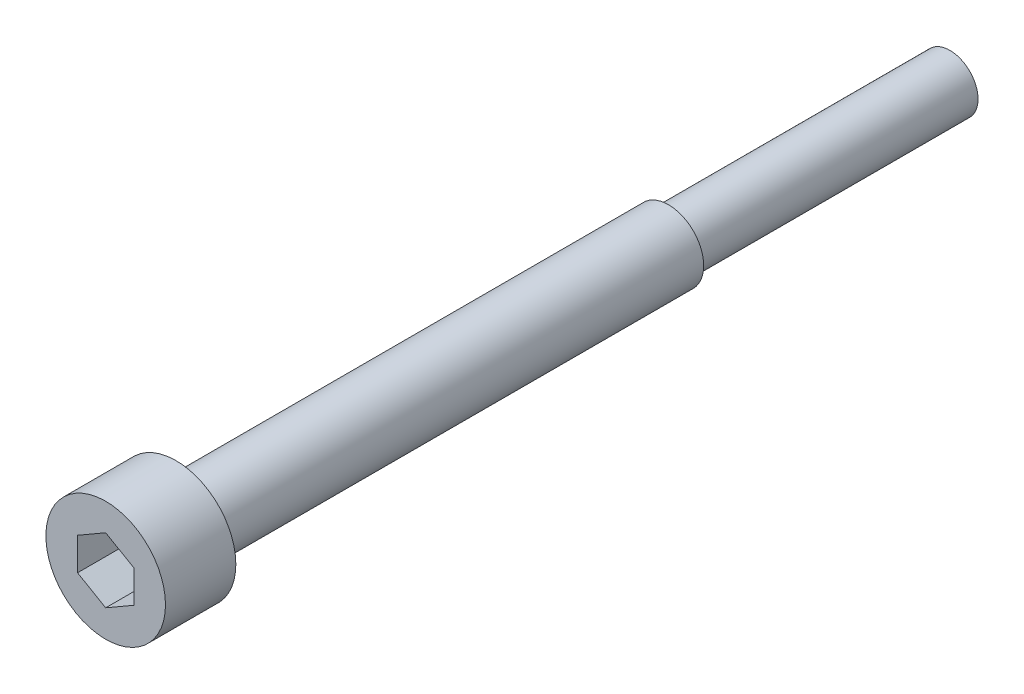
ISO-10303-21;
HEADER;
FILE_DESCRIPTION(('STEP AP214'),'2;1');
FILE_NAME('part.step','',(''),(''),'','','');
FILE_SCHEMA(('AUTOMOTIVE_DESIGN { 1 0 10303 214 1 1 1 1 }'));
ENDSEC;
DATA;
#1=APPLICATION_CONTEXT('core data for automotive mechanical design processes');
#2=APPLICATION_PROTOCOL_DEFINITION('international standard','automotive_design',2000,#1);
#3=PRODUCT_CONTEXT('',#1,'mechanical');
#4=PRODUCT('Part','Part','',(#3));
#5=PRODUCT_RELATED_PRODUCT_CATEGORY('part','',(#4));
#6=PRODUCT_DEFINITION_FORMATION('','',#4);
#7=PRODUCT_DEFINITION_CONTEXT('part definition',#1,'design');
#8=PRODUCT_DEFINITION('design','',#6,#7);
#9=PRODUCT_DEFINITION_SHAPE('','',#8);
#10=(LENGTH_UNIT() NAMED_UNIT(*) SI_UNIT(.MILLI.,.METRE.));
#11=(NAMED_UNIT(*) PLANE_ANGLE_UNIT() SI_UNIT($,.RADIAN.));
#12=(NAMED_UNIT(*) SI_UNIT($,.STERADIAN.) SOLID_ANGLE_UNIT());
#13=UNCERTAINTY_MEASURE_WITH_UNIT(LENGTH_MEASURE(1.E-05),#10,'distance_accuracy_value','');
#14=(GEOMETRIC_REPRESENTATION_CONTEXT(3) GLOBAL_UNCERTAINTY_ASSIGNED_CONTEXT((#13)) GLOBAL_UNIT_ASSIGNED_CONTEXT((#10,
#11,#12)) REPRESENTATION_CONTEXT('',''));
#15=CARTESIAN_POINT('',(0.,0.,0.));
#16=DIRECTION('',(0.,0.,1.));
#17=DIRECTION('',(1.,0.,0.));
#18=AXIS2_PLACEMENT_3D('',#15,#16,#17);
#19=CARTESIAN_POINT('',(0.,0.,55.));
#20=DIRECTION('',(0.,0.,-1.));
#21=DIRECTION('',(-1.,0.,0.));
#22=AXIS2_PLACEMENT_3D('',#19,#20,#21);
#23=CYLINDRICAL_SURFACE('',#22,2.5);
#24=CARTESIAN_POINT('',(0.,0.,55.));
#25=DIRECTION('',(0.,0.,1.));
#26=DIRECTION('',(1.,0.,0.));
#27=AXIS2_PLACEMENT_3D('',#24,#25,#26);
#28=CIRCLE('',#27,2.5);
#29=CARTESIAN_POINT('',(2.5,0.,55.));
#30=VERTEX_POINT('',#29);
#31=EDGE_CURVE('E11',#30,#30,#28,.T.);
#32=ORIENTED_EDGE('',*,*,#31,.F.);
#33=EDGE_LOOP('',(#32));
#34=FACE_BOUND('',#33,.T.);
#35=CARTESIAN_POINT('',(0.,0.,20.));
#36=DIRECTION('',(0.,0.,-1.));
#37=DIRECTION('',(-1.,0.,0.));
#38=AXIS2_PLACEMENT_3D('',#35,#36,#37);
#39=CIRCLE('',#38,2.5);
#40=CARTESIAN_POINT('',(-2.5,0.,20.));
#41=VERTEX_POINT('',#40);
#42=EDGE_CURVE('E124',#41,#41,#39,.T.);
#43=ORIENTED_EDGE('',*,*,#42,.F.);
#44=EDGE_LOOP('',(#43));
#45=FACE_BOUND('',#44,.T.);
#46=ADVANCED_FACE('F35',(#34,#45),#23,.T.);
#47=CARTESIAN_POINT('',(0.,0.,60.));
#48=DIRECTION('',(0.,0.,-1.));
#49=DIRECTION('',(-1.,0.,0.));
#50=AXIS2_PLACEMENT_3D('',#47,#48,#49);
#51=CYLINDRICAL_SURFACE('',#50,4.25);
#52=CARTESIAN_POINT('',(0.,0.,60.));
#53=DIRECTION('',(0.,0.,1.));
#54=DIRECTION('',(1.,0.,0.));
#55=AXIS2_PLACEMENT_3D('',#52,#53,#54);
#56=CIRCLE('',#55,4.25);
#57=CARTESIAN_POINT('',(4.25,0.,60.));
#58=VERTEX_POINT('',#57);
#59=EDGE_CURVE('E42',#58,#58,#56,.T.);
#60=ORIENTED_EDGE('',*,*,#59,.F.);
#61=EDGE_LOOP('',(#60));
#62=FACE_BOUND('',#61,.T.);
#63=CARTESIAN_POINT('',(0.,0.,55.));
#64=DIRECTION('',(0.,0.,1.));
#65=DIRECTION('',(1.,0.,0.));
#66=AXIS2_PLACEMENT_3D('',#63,#64,#65);
#67=CIRCLE('',#66,4.25);
#68=CARTESIAN_POINT('',(4.25,0.,55.));
#69=VERTEX_POINT('',#68);
#70=EDGE_CURVE('E137',#69,#69,#67,.T.);
#71=ORIENTED_EDGE('',*,*,#70,.T.);
#72=EDGE_LOOP('',(#71));
#73=FACE_BOUND('',#72,.T.);
#74=ADVANCED_FACE('F147',(#62,#73),#51,.T.);
#75=CARTESIAN_POINT('',(0.,0.,60.));
#76=DIRECTION('',(0.,0.,1.));
#77=DIRECTION('',(1.,0.,0.));
#78=AXIS2_PLACEMENT_3D('',#75,#76,#77);
#79=PLANE('',#78);
#80=DIRECTION('',(-0.866025403784439,0.5,0.));
#81=VECTOR('',#80,1.);
#82=CARTESIAN_POINT('',(2.,1.15470053837925,60.));
#83=LINE('',#82,#81);
#84=CARTESIAN_POINT('',(2.,1.15470053837925,60.));
#85=VERTEX_POINT('',#84);
#86=CARTESIAN_POINT('',(0.,2.3094010767585,60.));
#87=VERTEX_POINT('',#86);
#88=EDGE_CURVE('E49',#85,#87,#83,.T.);
#89=ORIENTED_EDGE('',*,*,#88,.F.);
#90=DIRECTION('',(0.,1.,0.));
#91=VECTOR('',#90,1.);
#92=CARTESIAN_POINT('',(2.,-1.15470053837925,60.));
#93=LINE('',#92,#91);
#94=CARTESIAN_POINT('',(2.,-1.15470053837925,60.));
#95=VERTEX_POINT('',#94);
#96=EDGE_CURVE('E133',#95,#85,#93,.T.);
#97=ORIENTED_EDGE('',*,*,#96,.F.);
#98=DIRECTION('',(0.866025403784439,0.5,0.));
#99=VECTOR('',#98,1.);
#100=CARTESIAN_POINT('',(0.,-2.3094010767585,60.));
#101=LINE('',#100,#99);
#102=CARTESIAN_POINT('',(0.,-2.3094010767585,60.));
#103=VERTEX_POINT('',#102);
#104=EDGE_CURVE('E131',#103,#95,#101,.T.);
#105=ORIENTED_EDGE('',*,*,#104,.F.);
#106=DIRECTION('',(0.866025403784439,-0.5,0.));
#107=VECTOR('',#106,1.);
#108=CARTESIAN_POINT('',(-2.,-1.15470053837925,60.));
#109=LINE('',#108,#107);
#110=CARTESIAN_POINT('',(-2.,-1.15470053837925,60.));
#111=VERTEX_POINT('',#110);
#112=EDGE_CURVE('E97',#111,#103,#109,.T.);
#113=ORIENTED_EDGE('',*,*,#112,.F.);
#114=DIRECTION('',(0.,-1.,0.));
#115=VECTOR('',#114,1.);
#116=CARTESIAN_POINT('',(-2.,1.15470053837925,60.));
#117=LINE('',#116,#115);
#118=CARTESIAN_POINT('',(-2.,1.15470053837925,60.));
#119=VERTEX_POINT('',#118);
#120=EDGE_CURVE('E127',#119,#111,#117,.T.);
#121=ORIENTED_EDGE('',*,*,#120,.F.);
#122=DIRECTION('',(-0.866025403784439,-0.5,0.));
#123=VECTOR('',#122,1.);
#124=CARTESIAN_POINT('',(0.,2.3094010767585,60.));
#125=LINE('',#124,#123);
#126=EDGE_CURVE('E123',#87,#119,#125,.T.);
#127=ORIENTED_EDGE('',*,*,#126,.F.);
#128=EDGE_LOOP('',(#89,#97,#105,#113,#121,#127));
#129=FACE_BOUND('',#128,.T.);
#130=ORIENTED_EDGE('',*,*,#59,.T.);
#131=EDGE_LOOP('',(#130));
#132=FACE_BOUND('',#131,.T.);
#133=ADVANCED_FACE('F152',(#129,#132),#79,.T.);
#134=CARTESIAN_POINT('',(0.,0.,55.));
#135=DIRECTION('',(0.,0.,1.));
#136=DIRECTION('',(1.,0.,0.));
#137=AXIS2_PLACEMENT_3D('',#134,#135,#136);
#138=PLANE('',#137);
#139=ORIENTED_EDGE('',*,*,#31,.T.);
#140=EDGE_LOOP('',(#139));
#141=FACE_BOUND('',#140,.T.);
#142=ORIENTED_EDGE('',*,*,#70,.F.);
#143=EDGE_LOOP('',(#142));
#144=FACE_BOUND('',#143,.T.);
#145=ADVANCED_FACE('F149',(#141,#144),#138,.F.);
#146=CARTESIAN_POINT('',(2.,1.15470053837925,57.));
#147=DIRECTION('',(0.5,0.866025403784439,0.));
#148=DIRECTION('',(-0.866025403784439,0.5,0.));
#149=AXIS2_PLACEMENT_3D('',#146,#147,#148);
#150=PLANE('',#149);
#151=ORIENTED_EDGE('',*,*,#88,.T.);
#152=DIRECTION('',(0.,0.,1.));
#153=VECTOR('',#152,1.);
#154=CARTESIAN_POINT('',(0.,2.3094010767585,57.));
#155=LINE('',#154,#153);
#156=CARTESIAN_POINT('',(0.,2.3094010767585,57.));
#157=VERTEX_POINT('',#156);
#158=EDGE_CURVE('E79',#157,#87,#155,.T.);
#159=ORIENTED_EDGE('',*,*,#158,.F.);
#160=DIRECTION('',(-0.866025403784439,0.5,0.));
#161=VECTOR('',#160,1.);
#162=CARTESIAN_POINT('',(2.,1.15470053837925,57.));
#163=LINE('',#162,#161);
#164=CARTESIAN_POINT('',(2.,1.15470053837925,57.));
#165=VERTEX_POINT('',#164);
#166=EDGE_CURVE('E135',#165,#157,#163,.T.);
#167=ORIENTED_EDGE('',*,*,#166,.F.);
#168=DIRECTION('',(0.,0.,1.));
#169=VECTOR('',#168,1.);
#170=CARTESIAN_POINT('',(2.,1.15470053837925,57.));
#171=LINE('',#170,#169);
#172=EDGE_CURVE('E57',#165,#85,#171,.T.);
#173=ORIENTED_EDGE('',*,*,#172,.T.);
#174=EDGE_LOOP('',(#151,#159,#167,#173));
#175=FACE_BOUND('',#174,.T.);
#176=ADVANCED_FACE('F151',(#175),#150,.F.);
#177=CARTESIAN_POINT('',(2.,-1.15470053837925,57.));
#178=DIRECTION('',(1.,0.,0.));
#179=DIRECTION('',(0.,0.,-1.));
#180=AXIS2_PLACEMENT_3D('',#177,#178,#179);
#181=PLANE('',#180);
#182=ORIENTED_EDGE('',*,*,#96,.T.);
#183=ORIENTED_EDGE('',*,*,#172,.F.);
#184=DIRECTION('',(0.,1.,0.));
#185=VECTOR('',#184,1.);
#186=CARTESIAN_POINT('',(2.,-1.15470053837925,57.));
#187=LINE('',#186,#185);
#188=CARTESIAN_POINT('',(2.,-1.15470053837925,57.));
#189=VERTEX_POINT('',#188);
#190=EDGE_CURVE('E109',#189,#165,#187,.T.);
#191=ORIENTED_EDGE('',*,*,#190,.F.);
#192=DIRECTION('',(0.,0.,1.));
#193=VECTOR('',#192,1.);
#194=CARTESIAN_POINT('',(2.,-1.15470053837925,57.));
#195=LINE('',#194,#193);
#196=EDGE_CURVE('E101',#189,#95,#195,.T.);
#197=ORIENTED_EDGE('',*,*,#196,.T.);
#198=EDGE_LOOP('',(#182,#183,#191,#197));
#199=FACE_BOUND('',#198,.T.);
#200=ADVANCED_FACE('F159',(#199),#181,.F.);
#201=CARTESIAN_POINT('',(0.,-2.3094010767585,57.));
#202=DIRECTION('',(0.5,-0.866025403784439,0.));
#203=DIRECTION('',(0.866025403784439,0.5,0.));
#204=AXIS2_PLACEMENT_3D('',#201,#202,#203);
#205=PLANE('',#204);
#206=ORIENTED_EDGE('',*,*,#104,.T.);
#207=ORIENTED_EDGE('',*,*,#196,.F.);
#208=DIRECTION('',(0.866025403784439,0.5,0.));
#209=VECTOR('',#208,1.);
#210=CARTESIAN_POINT('',(0.,-2.3094010767585,57.));
#211=LINE('',#210,#209);
#212=CARTESIAN_POINT('',(0.,-2.3094010767585,57.));
#213=VERTEX_POINT('',#212);
#214=EDGE_CURVE('E105',#213,#189,#211,.T.);
#215=ORIENTED_EDGE('',*,*,#214,.F.);
#216=DIRECTION('',(0.,0.,1.));
#217=VECTOR('',#216,1.);
#218=CARTESIAN_POINT('',(0.,-2.3094010767585,57.));
#219=LINE('',#218,#217);
#220=EDGE_CURVE('E90',#213,#103,#219,.T.);
#221=ORIENTED_EDGE('',*,*,#220,.T.);
#222=EDGE_LOOP('',(#206,#207,#215,#221));
#223=FACE_BOUND('',#222,.T.);
#224=ADVANCED_FACE('F106',(#223),#205,.F.);
#225=CARTESIAN_POINT('',(-2.,-1.15470053837925,57.));
#226=DIRECTION('',(-0.5,-0.866025403784439,0.));
#227=DIRECTION('',(0.866025403784439,-0.5,0.));
#228=AXIS2_PLACEMENT_3D('',#225,#226,#227);
#229=PLANE('',#228);
#230=ORIENTED_EDGE('',*,*,#112,.T.);
#231=ORIENTED_EDGE('',*,*,#220,.F.);
#232=DIRECTION('',(0.866025403784439,-0.5,0.));
#233=VECTOR('',#232,1.);
#234=CARTESIAN_POINT('',(-2.,-1.15470053837925,57.));
#235=LINE('',#234,#233);
#236=CARTESIAN_POINT('',(-2.,-1.15470053837925,57.));
#237=VERTEX_POINT('',#236);
#238=EDGE_CURVE('E94',#237,#213,#235,.T.);
#239=ORIENTED_EDGE('',*,*,#238,.F.);
#240=DIRECTION('',(0.,0.,1.));
#241=VECTOR('',#240,1.);
#242=CARTESIAN_POINT('',(-2.,-1.15470053837925,57.));
#243=LINE('',#242,#241);
#244=EDGE_CURVE('E102',#237,#111,#243,.T.);
#245=ORIENTED_EDGE('',*,*,#244,.T.);
#246=EDGE_LOOP('',(#230,#231,#239,#245));
#247=FACE_BOUND('',#246,.T.);
#248=ADVANCED_FACE('F92',(#247),#229,.F.);
#249=CARTESIAN_POINT('',(-2.,1.15470053837925,57.));
#250=DIRECTION('',(-1.,0.,0.));
#251=DIRECTION('',(0.,-1.,0.));
#252=AXIS2_PLACEMENT_3D('',#249,#250,#251);
#253=PLANE('',#252);
#254=ORIENTED_EDGE('',*,*,#120,.T.);
#255=ORIENTED_EDGE('',*,*,#244,.F.);
#256=DIRECTION('',(0.,-1.,0.));
#257=VECTOR('',#256,1.);
#258=CARTESIAN_POINT('',(-2.,1.15470053837925,57.));
#259=LINE('',#258,#257);
#260=CARTESIAN_POINT('',(-2.,1.15470053837925,57.));
#261=VERTEX_POINT('',#260);
#262=EDGE_CURVE('E115',#261,#237,#259,.T.);
#263=ORIENTED_EDGE('',*,*,#262,.F.);
#264=DIRECTION('',(0.,0.,1.));
#265=VECTOR('',#264,1.);
#266=CARTESIAN_POINT('',(-2.,1.15470053837925,57.));
#267=LINE('',#266,#265);
#268=EDGE_CURVE('E140',#261,#119,#267,.T.);
#269=ORIENTED_EDGE('',*,*,#268,.T.);
#270=EDGE_LOOP('',(#254,#255,#263,#269));
#271=FACE_BOUND('',#270,.T.);
#272=ADVANCED_FACE('F189',(#271),#253,.F.);
#273=CARTESIAN_POINT('',(0.,2.3094010767585,57.));
#274=DIRECTION('',(-0.5,0.866025403784439,0.));
#275=DIRECTION('',(-0.866025403784439,-0.5,0.));
#276=AXIS2_PLACEMENT_3D('',#273,#274,#275);
#277=PLANE('',#276);
#278=ORIENTED_EDGE('',*,*,#126,.T.);
#279=ORIENTED_EDGE('',*,*,#268,.F.);
#280=DIRECTION('',(-0.866025403784439,-0.5,0.));
#281=VECTOR('',#280,1.);
#282=CARTESIAN_POINT('',(0.,2.3094010767585,57.));
#283=LINE('',#282,#281);
#284=EDGE_CURVE('E117',#157,#261,#283,.T.);
#285=ORIENTED_EDGE('',*,*,#284,.F.);
#286=ORIENTED_EDGE('',*,*,#158,.T.);
#287=EDGE_LOOP('',(#278,#279,#285,#286));
#288=FACE_BOUND('',#287,.T.);
#289=ADVANCED_FACE('F185',(#288),#277,.F.);
#290=CARTESIAN_POINT('',(0.,0.,57.));
#291=DIRECTION('',(0.,0.,1.));
#292=DIRECTION('',(1.,0.,0.));
#293=AXIS2_PLACEMENT_3D('',#290,#291,#292);
#294=PLANE('',#293);
#295=ORIENTED_EDGE('',*,*,#166,.T.);
#296=ORIENTED_EDGE('',*,*,#284,.T.);
#297=ORIENTED_EDGE('',*,*,#262,.T.);
#298=ORIENTED_EDGE('',*,*,#238,.T.);
#299=ORIENTED_EDGE('',*,*,#214,.T.);
#300=ORIENTED_EDGE('',*,*,#190,.T.);
#301=EDGE_LOOP('',(#295,#296,#297,#298,#299,#300));
#302=FACE_BOUND('',#301,.T.);
#303=ADVANCED_FACE('F112',(#302),#294,.T.);
#304=CARTESIAN_POINT('',(0.,0.,20.));
#305=DIRECTION('',(0.,0.,-1.));
#306=DIRECTION('',(-1.,0.,0.));
#307=AXIS2_PLACEMENT_3D('',#304,#305,#306);
#308=PLANE('',#307);
#309=CARTESIAN_POINT('',(0.,0.,20.));
#310=DIRECTION('',(0.,0.,-1.));
#311=DIRECTION('',(-1.,0.,0.));
#312=AXIS2_PLACEMENT_3D('',#309,#310,#311);
#313=CIRCLE('',#312,2.);
#314=CARTESIAN_POINT('',(-2.,0.,20.));
#315=VERTEX_POINT('',#314);
#316=EDGE_CURVE('E177',#315,#315,#313,.T.);
#317=ORIENTED_EDGE('',*,*,#316,.F.);
#318=EDGE_LOOP('',(#317));
#319=FACE_BOUND('',#318,.T.);
#320=ORIENTED_EDGE('',*,*,#42,.T.);
#321=EDGE_LOOP('',(#320));
#322=FACE_BOUND('',#321,.T.);
#323=ADVANCED_FACE('F209',(#319,#322),#308,.T.);
#324=CARTESIAN_POINT('',(0.,0.,20.));
#325=DIRECTION('',(0.,0.,-1.));
#326=DIRECTION('',(-1.,0.,0.));
#327=AXIS2_PLACEMENT_3D('',#324,#325,#326);
#328=CYLINDRICAL_SURFACE('',#327,2.);
#329=ORIENTED_EDGE('',*,*,#316,.T.);
#330=EDGE_LOOP('',(#329));
#331=FACE_BOUND('',#330,.T.);
#332=CARTESIAN_POINT('',(0.,0.,0.));
#333=DIRECTION('',(0.,0.,-1.));
#334=DIRECTION('',(-1.,0.,0.));
#335=AXIS2_PLACEMENT_3D('',#332,#333,#334);
#336=CIRCLE('',#335,2.);
#337=CARTESIAN_POINT('',(-2.,0.,0.));
#338=VERTEX_POINT('',#337);
#339=EDGE_CURVE('E180',#338,#338,#336,.T.);
#340=ORIENTED_EDGE('',*,*,#339,.F.);
#341=EDGE_LOOP('',(#340));
#342=FACE_BOUND('',#341,.T.);
#343=ADVANCED_FACE('F213',(#331,#342),#328,.T.);
#344=CARTESIAN_POINT('',(0.,0.,0.));
#345=DIRECTION('',(0.,0.,1.));
#346=DIRECTION('',(1.,0.,0.));
#347=AXIS2_PLACEMENT_3D('',#344,#345,#346);
#348=PLANE('',#347);
#349=ORIENTED_EDGE('',*,*,#339,.T.);
#350=EDGE_LOOP('',(#349));
#351=FACE_BOUND('',#350,.T.);
#352=ADVANCED_FACE('F218',(#351),#348,.F.);
#353=CLOSED_SHELL('',(#46,#74,#133,#145,#176,#200,#224,#248,#272,#289,#303,#323,#343,#352));
#354=MANIFOLD_SOLID_BREP('B2',#353);
#355=ADVANCED_BREP_SHAPE_REPRESENTATION('',(#18,#354),#14);
#356=SHAPE_DEFINITION_REPRESENTATION(#9,#355);
ENDSEC;
END-ISO-10303-21;
